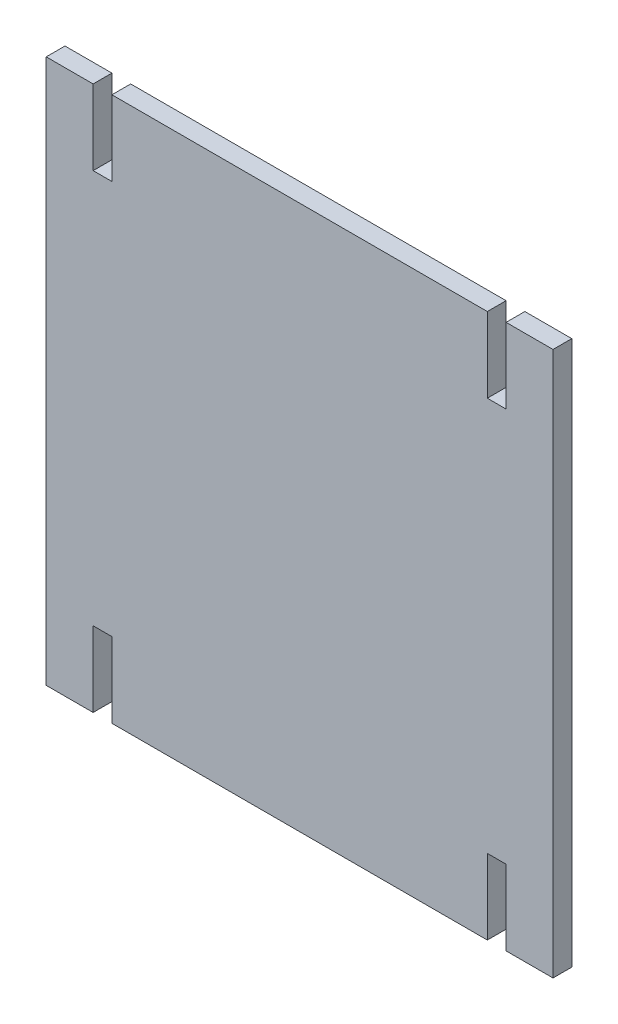
ISO-10303-21;
HEADER;
FILE_DESCRIPTION(('STEP AP214'),'2;1');
FILE_NAME('part.step','',(''),(''),'','','');
FILE_SCHEMA(('AUTOMOTIVE_DESIGN { 1 0 10303 214 1 1 1 1 }'));
ENDSEC;
DATA;
#1=APPLICATION_CONTEXT('core data for automotive mechanical design processes');
#2=APPLICATION_PROTOCOL_DEFINITION('international standard','automotive_design',2000,#1);
#3=PRODUCT_CONTEXT('',#1,'mechanical');
#4=PRODUCT('Part','Part','',(#3));
#5=PRODUCT_RELATED_PRODUCT_CATEGORY('part','',(#4));
#6=PRODUCT_DEFINITION_FORMATION('','',#4);
#7=PRODUCT_DEFINITION_CONTEXT('part definition',#1,'design');
#8=PRODUCT_DEFINITION('design','',#6,#7);
#9=PRODUCT_DEFINITION_SHAPE('','',#8);
#10=(LENGTH_UNIT() NAMED_UNIT(*) SI_UNIT(.MILLI.,.METRE.));
#11=(NAMED_UNIT(*) PLANE_ANGLE_UNIT() SI_UNIT($,.RADIAN.));
#12=(NAMED_UNIT(*) SI_UNIT($,.STERADIAN.) SOLID_ANGLE_UNIT());
#13=UNCERTAINTY_MEASURE_WITH_UNIT(LENGTH_MEASURE(1.E-05),#10,'distance_accuracy_value','');
#14=(GEOMETRIC_REPRESENTATION_CONTEXT(3) GLOBAL_UNCERTAINTY_ASSIGNED_CONTEXT((#13)) GLOBAL_UNIT_ASSIGNED_CONTEXT((#10,
#11,#12)) REPRESENTATION_CONTEXT('',''));
#15=CARTESIAN_POINT('',(0.,0.,0.));
#16=DIRECTION('',(0.,0.,1.));
#17=DIRECTION('',(1.,0.,0.));
#18=AXIS2_PLACEMENT_3D('',#15,#16,#17);
#19=CARTESIAN_POINT('',(50.8,0.,2.54));
#20=DIRECTION('',(0.,-1.,0.));
#21=DIRECTION('',(0.,0.,-1.));
#22=AXIS2_PLACEMENT_3D('',#19,#20,#21);
#23=PLANE('',#22);
#24=DIRECTION('',(-1.,0.,0.));
#25=VECTOR('',#24,1.);
#26=CARTESIAN_POINT('',(50.8,0.,0.));
#27=LINE('',#26,#25);
#28=CARTESIAN_POINT('',(50.8,0.,0.));
#29=VERTEX_POINT('',#28);
#30=CARTESIAN_POINT('',(0.,0.,0.));
#31=VERTEX_POINT('',#30);
#32=EDGE_CURVE('E200',#29,#31,#27,.T.);
#33=ORIENTED_EDGE('',*,*,#32,.T.);
#34=DIRECTION('',(0.,0.,-1.));
#35=VECTOR('',#34,1.);
#36=CARTESIAN_POINT('',(0.,0.,2.54));
#37=LINE('',#36,#35);
#38=CARTESIAN_POINT('',(0.,0.,2.54));
#39=VERTEX_POINT('',#38);
#40=EDGE_CURVE('E11',#39,#31,#37,.T.);
#41=ORIENTED_EDGE('',*,*,#40,.F.);
#42=DIRECTION('',(-1.,0.,0.));
#43=VECTOR('',#42,1.);
#44=CARTESIAN_POINT('',(50.8,0.,2.54));
#45=LINE('',#44,#43);
#46=CARTESIAN_POINT('',(50.8,0.,2.54));
#47=VERTEX_POINT('',#46);
#48=EDGE_CURVE('E238',#47,#39,#45,.T.);
#49=ORIENTED_EDGE('',*,*,#48,.F.);
#50=DIRECTION('',(0.,0.,-1.));
#51=VECTOR('',#50,1.);
#52=CARTESIAN_POINT('',(50.8,0.,2.54));
#53=LINE('',#52,#51);
#54=EDGE_CURVE('E196',#47,#29,#53,.T.);
#55=ORIENTED_EDGE('',*,*,#54,.T.);
#56=EDGE_LOOP('',(#33,#41,#49,#55));
#57=FACE_BOUND('',#56,.T.);
#58=ADVANCED_FACE('F32',(#57),#23,.F.);
#59=CARTESIAN_POINT('',(0.,0.,2.54));
#60=DIRECTION('',(1.,0.,0.));
#61=DIRECTION('',(0.,1.,0.));
#62=AXIS2_PLACEMENT_3D('',#59,#60,#61);
#63=PLANE('',#62);
#64=DIRECTION('',(0.,-1.,0.));
#65=VECTOR('',#64,1.);
#66=CARTESIAN_POINT('',(0.,0.,0.));
#67=LINE('',#66,#65);
#68=CARTESIAN_POINT('',(0.,-10.16,0.));
#69=VERTEX_POINT('',#68);
#70=EDGE_CURVE('E203',#31,#69,#67,.T.);
#71=ORIENTED_EDGE('',*,*,#70,.T.);
#72=DIRECTION('',(0.,0.,-1.));
#73=VECTOR('',#72,1.);
#74=CARTESIAN_POINT('',(0.,-10.16,2.54));
#75=LINE('',#74,#73);
#76=CARTESIAN_POINT('',(0.,-10.16,2.54));
#77=VERTEX_POINT('',#76);
#78=EDGE_CURVE('E40',#77,#69,#75,.T.);
#79=ORIENTED_EDGE('',*,*,#78,.F.);
#80=DIRECTION('',(0.,-1.,0.));
#81=VECTOR('',#80,1.);
#82=CARTESIAN_POINT('',(0.,0.,2.54));
#83=LINE('',#82,#81);
#84=EDGE_CURVE('E127',#39,#77,#83,.T.);
#85=ORIENTED_EDGE('',*,*,#84,.F.);
#86=ORIENTED_EDGE('',*,*,#40,.T.);
#87=EDGE_LOOP('',(#71,#79,#85,#86));
#88=FACE_BOUND('',#87,.T.);
#89=ADVANCED_FACE('F356',(#88),#63,.F.);
#90=CARTESIAN_POINT('',(0.,-10.16,2.54));
#91=DIRECTION('',(0.,-1.,0.));
#92=DIRECTION('',(0.,0.,-1.));
#93=AXIS2_PLACEMENT_3D('',#90,#91,#92);
#94=PLANE('',#93);
#95=DIRECTION('',(-1.,0.,0.));
#96=VECTOR('',#95,1.);
#97=CARTESIAN_POINT('',(0.,-10.16,0.));
#98=LINE('',#97,#96);
#99=CARTESIAN_POINT('',(-2.54,-10.16,0.));
#100=VERTEX_POINT('',#99);
#101=EDGE_CURVE('E205',#69,#100,#98,.T.);
#102=ORIENTED_EDGE('',*,*,#101,.T.);
#103=DIRECTION('',(0.,0.,-1.));
#104=VECTOR('',#103,1.);
#105=CARTESIAN_POINT('',(-2.54,-10.16,2.54));
#106=LINE('',#105,#104);
#107=CARTESIAN_POINT('',(-2.54,-10.16,2.54));
#108=VERTEX_POINT('',#107);
#109=EDGE_CURVE('E281',#108,#100,#106,.T.);
#110=ORIENTED_EDGE('',*,*,#109,.F.);
#111=DIRECTION('',(-1.,0.,0.));
#112=VECTOR('',#111,1.);
#113=CARTESIAN_POINT('',(0.,-10.16,2.54));
#114=LINE('',#113,#112);
#115=EDGE_CURVE('E289',#77,#108,#114,.T.);
#116=ORIENTED_EDGE('',*,*,#115,.F.);
#117=ORIENTED_EDGE('',*,*,#78,.T.);
#118=EDGE_LOOP('',(#102,#110,#116,#117));
#119=FACE_BOUND('',#118,.T.);
#120=ADVANCED_FACE('F287',(#119),#94,.F.);
#121=CARTESIAN_POINT('',(-2.54,-10.16,2.54));
#122=DIRECTION('',(-1.,0.,0.));
#123=DIRECTION('',(0.,0.,1.));
#124=AXIS2_PLACEMENT_3D('',#121,#122,#123);
#125=PLANE('',#124);
#126=DIRECTION('',(0.,1.,0.));
#127=VECTOR('',#126,1.);
#128=CARTESIAN_POINT('',(-2.54,-10.16,0.));
#129=LINE('',#128,#127);
#130=CARTESIAN_POINT('',(-2.54,0.,0.));
#131=VERTEX_POINT('',#130);
#132=EDGE_CURVE('E207',#100,#131,#129,.T.);
#133=ORIENTED_EDGE('',*,*,#132,.T.);
#134=DIRECTION('',(0.,0.,-1.));
#135=VECTOR('',#134,1.);
#136=CARTESIAN_POINT('',(-2.54,0.,2.54));
#137=LINE('',#136,#135);
#138=CARTESIAN_POINT('',(-2.54,0.,2.54));
#139=VERTEX_POINT('',#138);
#140=EDGE_CURVE('E278',#139,#131,#137,.T.);
#141=ORIENTED_EDGE('',*,*,#140,.F.);
#142=DIRECTION('',(0.,1.,0.));
#143=VECTOR('',#142,1.);
#144=CARTESIAN_POINT('',(-2.54,-10.16,2.54));
#145=LINE('',#144,#143);
#146=EDGE_CURVE('E307',#108,#139,#145,.T.);
#147=ORIENTED_EDGE('',*,*,#146,.F.);
#148=ORIENTED_EDGE('',*,*,#109,.T.);
#149=EDGE_LOOP('',(#133,#141,#147,#148));
#150=FACE_BOUND('',#149,.T.);
#151=ADVANCED_FACE('F298',(#150),#125,.F.);
#152=CARTESIAN_POINT('',(-2.54,0.,2.54));
#153=DIRECTION('',(0.,-1.,0.));
#154=DIRECTION('',(0.,0.,-1.));
#155=AXIS2_PLACEMENT_3D('',#152,#153,#154);
#156=PLANE('',#155);
#157=DIRECTION('',(-1.,0.,0.));
#158=VECTOR('',#157,1.);
#159=CARTESIAN_POINT('',(-2.54,0.,0.));
#160=LINE('',#159,#158);
#161=CARTESIAN_POINT('',(-8.89,0.,0.));
#162=VERTEX_POINT('',#161);
#163=EDGE_CURVE('E209',#131,#162,#160,.T.);
#164=ORIENTED_EDGE('',*,*,#163,.T.);
#165=DIRECTION('',(0.,0.,-1.));
#166=VECTOR('',#165,1.);
#167=CARTESIAN_POINT('',(-8.89,0.,2.54));
#168=LINE('',#167,#166);
#169=CARTESIAN_POINT('',(-8.89,0.,2.54));
#170=VERTEX_POINT('',#169);
#171=EDGE_CURVE('E275',#170,#162,#168,.T.);
#172=ORIENTED_EDGE('',*,*,#171,.F.);
#173=DIRECTION('',(-1.,0.,0.));
#174=VECTOR('',#173,1.);
#175=CARTESIAN_POINT('',(-2.54,0.,2.54));
#176=LINE('',#175,#174);
#177=EDGE_CURVE('E304',#139,#170,#176,.T.);
#178=ORIENTED_EDGE('',*,*,#177,.F.);
#179=ORIENTED_EDGE('',*,*,#140,.T.);
#180=EDGE_LOOP('',(#164,#172,#178,#179));
#181=FACE_BOUND('',#180,.T.);
#182=ADVANCED_FACE('F302',(#181),#156,.F.);
#183=CARTESIAN_POINT('',(-8.89,0.,2.54));
#184=DIRECTION('',(1.,0.,0.));
#185=DIRECTION('',(0.,0.,-1.));
#186=AXIS2_PLACEMENT_3D('',#183,#184,#185);
#187=PLANE('',#186);
#188=DIRECTION('',(0.,-1.,0.));
#189=VECTOR('',#188,1.);
#190=CARTESIAN_POINT('',(-8.89,0.,0.));
#191=LINE('',#190,#189);
#192=CARTESIAN_POINT('',(-8.89,-73.66,0.));
#193=VERTEX_POINT('',#192);
#194=EDGE_CURVE('E211',#162,#193,#191,.T.);
#195=ORIENTED_EDGE('',*,*,#194,.T.);
#196=DIRECTION('',(0.,0.,-1.));
#197=VECTOR('',#196,1.);
#198=CARTESIAN_POINT('',(-8.89,-73.66,2.54));
#199=LINE('',#198,#197);
#200=CARTESIAN_POINT('',(-8.89,-73.66,2.54));
#201=VERTEX_POINT('',#200);
#202=EDGE_CURVE('E272',#201,#193,#199,.T.);
#203=ORIENTED_EDGE('',*,*,#202,.F.);
#204=DIRECTION('',(0.,-1.,0.));
#205=VECTOR('',#204,1.);
#206=CARTESIAN_POINT('',(-8.89,0.,2.54));
#207=LINE('',#206,#205);
#208=EDGE_CURVE('E306',#170,#201,#207,.T.);
#209=ORIENTED_EDGE('',*,*,#208,.F.);
#210=ORIENTED_EDGE('',*,*,#171,.T.);
#211=EDGE_LOOP('',(#195,#203,#209,#210));
#212=FACE_BOUND('',#211,.T.);
#213=ADVANCED_FACE('F369',(#212),#187,.F.);
#214=CARTESIAN_POINT('',(-8.89,-73.66,2.54));
#215=DIRECTION('',(0.,1.,0.));
#216=DIRECTION('',(0.,0.,1.));
#217=AXIS2_PLACEMENT_3D('',#214,#215,#216);
#218=PLANE('',#217);
#219=DIRECTION('',(1.,0.,0.));
#220=VECTOR('',#219,1.);
#221=CARTESIAN_POINT('',(-8.89,-73.66,0.));
#222=LINE('',#221,#220);
#223=CARTESIAN_POINT('',(-2.54,-73.66,0.));
#224=VERTEX_POINT('',#223);
#225=EDGE_CURVE('E213',#193,#224,#222,.T.);
#226=ORIENTED_EDGE('',*,*,#225,.T.);
#227=DIRECTION('',(0.,0.,-1.));
#228=VECTOR('',#227,1.);
#229=CARTESIAN_POINT('',(-2.54,-73.66,2.54));
#230=LINE('',#229,#228);
#231=CARTESIAN_POINT('',(-2.54,-73.66,2.54));
#232=VERTEX_POINT('',#231);
#233=EDGE_CURVE('E269',#232,#224,#230,.T.);
#234=ORIENTED_EDGE('',*,*,#233,.F.);
#235=DIRECTION('',(1.,0.,0.));
#236=VECTOR('',#235,1.);
#237=CARTESIAN_POINT('',(-8.89,-73.66,2.54));
#238=LINE('',#237,#236);
#239=EDGE_CURVE('E309',#201,#232,#238,.T.);
#240=ORIENTED_EDGE('',*,*,#239,.F.);
#241=ORIENTED_EDGE('',*,*,#202,.T.);
#242=EDGE_LOOP('',(#226,#234,#240,#241));
#243=FACE_BOUND('',#242,.T.);
#244=ADVANCED_FACE('F372',(#243),#218,.F.);
#245=CARTESIAN_POINT('',(-2.54,-73.66,2.54));
#246=DIRECTION('',(-1.,0.,0.));
#247=DIRECTION('',(0.,0.,1.));
#248=AXIS2_PLACEMENT_3D('',#245,#246,#247);
#249=PLANE('',#248);
#250=DIRECTION('',(0.,1.,0.));
#251=VECTOR('',#250,1.);
#252=CARTESIAN_POINT('',(-2.54,-73.66,0.));
#253=LINE('',#252,#251);
#254=CARTESIAN_POINT('',(-2.54,-63.5,0.));
#255=VERTEX_POINT('',#254);
#256=EDGE_CURVE('E215',#224,#255,#253,.T.);
#257=ORIENTED_EDGE('',*,*,#256,.T.);
#258=DIRECTION('',(0.,0.,-1.));
#259=VECTOR('',#258,1.);
#260=CARTESIAN_POINT('',(-2.54,-63.5,2.54));
#261=LINE('',#260,#259);
#262=CARTESIAN_POINT('',(-2.54,-63.5,2.54));
#263=VERTEX_POINT('',#262);
#264=EDGE_CURVE('E266',#263,#255,#261,.T.);
#265=ORIENTED_EDGE('',*,*,#264,.F.);
#266=DIRECTION('',(0.,1.,0.));
#267=VECTOR('',#266,1.);
#268=CARTESIAN_POINT('',(-2.54,-73.66,2.54));
#269=LINE('',#268,#267);
#270=EDGE_CURVE('E315',#232,#263,#269,.T.);
#271=ORIENTED_EDGE('',*,*,#270,.F.);
#272=ORIENTED_EDGE('',*,*,#233,.T.);
#273=EDGE_LOOP('',(#257,#265,#271,#272));
#274=FACE_BOUND('',#273,.T.);
#275=ADVANCED_FACE('F376',(#274),#249,.F.);
#276=CARTESIAN_POINT('',(0.,-63.5,2.54));
#277=DIRECTION('',(0.,1.,0.));
#278=DIRECTION('',(0.,0.,1.));
#279=AXIS2_PLACEMENT_3D('',#276,#277,#278);
#280=PLANE('',#279);
#281=DIRECTION('',(1.,0.,0.));
#282=VECTOR('',#281,1.);
#283=CARTESIAN_POINT('',(0.,-63.5,0.));
#284=LINE('',#283,#282);
#285=CARTESIAN_POINT('',(0.,-63.5,0.));
#286=VERTEX_POINT('',#285);
#287=EDGE_CURVE('E217',#255,#286,#284,.T.);
#288=ORIENTED_EDGE('',*,*,#287,.T.);
#289=DIRECTION('',(0.,0.,-1.));
#290=VECTOR('',#289,1.);
#291=CARTESIAN_POINT('',(0.,-63.5,2.54));
#292=LINE('',#291,#290);
#293=CARTESIAN_POINT('',(0.,-63.5,2.54));
#294=VERTEX_POINT('',#293);
#295=EDGE_CURVE('E263',#294,#286,#292,.T.);
#296=ORIENTED_EDGE('',*,*,#295,.F.);
#297=DIRECTION('',(1.,0.,0.));
#298=VECTOR('',#297,1.);
#299=CARTESIAN_POINT('',(0.,-63.5,2.54));
#300=LINE('',#299,#298);
#301=EDGE_CURVE('E317',#263,#294,#300,.T.);
#302=ORIENTED_EDGE('',*,*,#301,.F.);
#303=ORIENTED_EDGE('',*,*,#264,.T.);
#304=EDGE_LOOP('',(#288,#296,#302,#303));
#305=FACE_BOUND('',#304,.T.);
#306=ADVANCED_FACE('F380',(#305),#280,.F.);
#307=CARTESIAN_POINT('',(0.,-73.66,2.54));
#308=DIRECTION('',(1.,0.,0.));
#309=DIRECTION('',(0.,0.,-1.));
#310=AXIS2_PLACEMENT_3D('',#307,#308,#309);
#311=PLANE('',#310);
#312=DIRECTION('',(0.,-1.,0.));
#313=VECTOR('',#312,1.);
#314=CARTESIAN_POINT('',(0.,-73.66,0.));
#315=LINE('',#314,#313);
#316=CARTESIAN_POINT('',(0.,-73.66,0.));
#317=VERTEX_POINT('',#316);
#318=EDGE_CURVE('E219',#286,#317,#315,.T.);
#319=ORIENTED_EDGE('',*,*,#318,.T.);
#320=DIRECTION('',(0.,0.,-1.));
#321=VECTOR('',#320,1.);
#322=CARTESIAN_POINT('',(0.,-73.66,2.54));
#323=LINE('',#322,#321);
#324=CARTESIAN_POINT('',(0.,-73.66,2.54));
#325=VERTEX_POINT('',#324);
#326=EDGE_CURVE('E260',#325,#317,#323,.T.);
#327=ORIENTED_EDGE('',*,*,#326,.F.);
#328=DIRECTION('',(0.,-1.,0.));
#329=VECTOR('',#328,1.);
#330=CARTESIAN_POINT('',(0.,-73.66,2.54));
#331=LINE('',#330,#329);
#332=EDGE_CURVE('E319',#294,#325,#331,.T.);
#333=ORIENTED_EDGE('',*,*,#332,.F.);
#334=ORIENTED_EDGE('',*,*,#295,.T.);
#335=EDGE_LOOP('',(#319,#327,#333,#334));
#336=FACE_BOUND('',#335,.T.);
#337=ADVANCED_FACE('F384',(#336),#311,.F.);
#338=CARTESIAN_POINT('',(0.,-73.66,2.54));
#339=DIRECTION('',(0.,1.,0.));
#340=DIRECTION('',(0.,0.,1.));
#341=AXIS2_PLACEMENT_3D('',#338,#339,#340);
#342=PLANE('',#341);
#343=DIRECTION('',(1.,0.,0.));
#344=VECTOR('',#343,1.);
#345=CARTESIAN_POINT('',(0.,-73.66,0.));
#346=LINE('',#345,#344);
#347=CARTESIAN_POINT('',(50.8,-73.66,0.));
#348=VERTEX_POINT('',#347);
#349=EDGE_CURVE('E221',#317,#348,#346,.T.);
#350=ORIENTED_EDGE('',*,*,#349,.T.);
#351=DIRECTION('',(0.,0.,-1.));
#352=VECTOR('',#351,1.);
#353=CARTESIAN_POINT('',(50.8,-73.66,2.54));
#354=LINE('',#353,#352);
#355=CARTESIAN_POINT('',(50.8,-73.66,2.54));
#356=VERTEX_POINT('',#355);
#357=EDGE_CURVE('E257',#356,#348,#354,.T.);
#358=ORIENTED_EDGE('',*,*,#357,.F.);
#359=DIRECTION('',(1.,0.,0.));
#360=VECTOR('',#359,1.);
#361=CARTESIAN_POINT('',(0.,-73.66,2.54));
#362=LINE('',#361,#360);
#363=EDGE_CURVE('E321',#325,#356,#362,.T.);
#364=ORIENTED_EDGE('',*,*,#363,.F.);
#365=ORIENTED_EDGE('',*,*,#326,.T.);
#366=EDGE_LOOP('',(#350,#358,#364,#365));
#367=FACE_BOUND('',#366,.T.);
#368=ADVANCED_FACE('F388',(#367),#342,.F.);
#369=CARTESIAN_POINT('',(50.8,-73.66,2.54));
#370=DIRECTION('',(-1.,0.,0.));
#371=DIRECTION('',(0.,0.,1.));
#372=AXIS2_PLACEMENT_3D('',#369,#370,#371);
#373=PLANE('',#372);
#374=DIRECTION('',(0.,1.,0.));
#375=VECTOR('',#374,1.);
#376=CARTESIAN_POINT('',(50.8,-73.66,0.));
#377=LINE('',#376,#375);
#378=CARTESIAN_POINT('',(50.8,-63.5,0.));
#379=VERTEX_POINT('',#378);
#380=EDGE_CURVE('E223',#348,#379,#377,.T.);
#381=ORIENTED_EDGE('',*,*,#380,.T.);
#382=DIRECTION('',(0.,0.,-1.));
#383=VECTOR('',#382,1.);
#384=CARTESIAN_POINT('',(50.8,-63.5,2.54));
#385=LINE('',#384,#383);
#386=CARTESIAN_POINT('',(50.8,-63.5,2.54));
#387=VERTEX_POINT('',#386);
#388=EDGE_CURVE('E254',#387,#379,#385,.T.);
#389=ORIENTED_EDGE('',*,*,#388,.F.);
#390=DIRECTION('',(0.,1.,0.));
#391=VECTOR('',#390,1.);
#392=CARTESIAN_POINT('',(50.8,-73.66,2.54));
#393=LINE('',#392,#391);
#394=EDGE_CURVE('E323',#356,#387,#393,.T.);
#395=ORIENTED_EDGE('',*,*,#394,.F.);
#396=ORIENTED_EDGE('',*,*,#357,.T.);
#397=EDGE_LOOP('',(#381,#389,#395,#396));
#398=FACE_BOUND('',#397,.T.);
#399=ADVANCED_FACE('F392',(#398),#373,.F.);
#400=CARTESIAN_POINT('',(50.8,-63.5,2.54));
#401=DIRECTION('',(0.,1.,0.));
#402=DIRECTION('',(0.,0.,1.));
#403=AXIS2_PLACEMENT_3D('',#400,#401,#402);
#404=PLANE('',#403);
#405=DIRECTION('',(1.,0.,0.));
#406=VECTOR('',#405,1.);
#407=CARTESIAN_POINT('',(50.8,-63.5,0.));
#408=LINE('',#407,#406);
#409=CARTESIAN_POINT('',(53.34,-63.5,0.));
#410=VERTEX_POINT('',#409);
#411=EDGE_CURVE('E225',#379,#410,#408,.T.);
#412=ORIENTED_EDGE('',*,*,#411,.T.);
#413=DIRECTION('',(0.,0.,-1.));
#414=VECTOR('',#413,1.);
#415=CARTESIAN_POINT('',(53.34,-63.5,2.54));
#416=LINE('',#415,#414);
#417=CARTESIAN_POINT('',(53.34,-63.5,2.54));
#418=VERTEX_POINT('',#417);
#419=EDGE_CURVE('E251',#418,#410,#416,.T.);
#420=ORIENTED_EDGE('',*,*,#419,.F.);
#421=DIRECTION('',(1.,0.,0.));
#422=VECTOR('',#421,1.);
#423=CARTESIAN_POINT('',(50.8,-63.5,2.54));
#424=LINE('',#423,#422);
#425=EDGE_CURVE('E325',#387,#418,#424,.T.);
#426=ORIENTED_EDGE('',*,*,#425,.F.);
#427=ORIENTED_EDGE('',*,*,#388,.T.);
#428=EDGE_LOOP('',(#412,#420,#426,#427));
#429=FACE_BOUND('',#428,.T.);
#430=ADVANCED_FACE('F396',(#429),#404,.F.);
#431=CARTESIAN_POINT('',(53.34,-63.5,2.54));
#432=DIRECTION('',(1.,0.,0.));
#433=DIRECTION('',(0.,0.,-1.));
#434=AXIS2_PLACEMENT_3D('',#431,#432,#433);
#435=PLANE('',#434);
#436=DIRECTION('',(0.,-1.,0.));
#437=VECTOR('',#436,1.);
#438=CARTESIAN_POINT('',(53.34,-63.5,0.));
#439=LINE('',#438,#437);
#440=CARTESIAN_POINT('',(53.34,-73.66,0.));
#441=VERTEX_POINT('',#440);
#442=EDGE_CURVE('E227',#410,#441,#439,.T.);
#443=ORIENTED_EDGE('',*,*,#442,.T.);
#444=DIRECTION('',(0.,0.,-1.));
#445=VECTOR('',#444,1.);
#446=CARTESIAN_POINT('',(53.34,-73.66,2.54));
#447=LINE('',#446,#445);
#448=CARTESIAN_POINT('',(53.34,-73.66,2.54));
#449=VERTEX_POINT('',#448);
#450=EDGE_CURVE('E248',#449,#441,#447,.T.);
#451=ORIENTED_EDGE('',*,*,#450,.F.);
#452=DIRECTION('',(0.,-1.,0.));
#453=VECTOR('',#452,1.);
#454=CARTESIAN_POINT('',(53.34,-63.5,2.54));
#455=LINE('',#454,#453);
#456=EDGE_CURVE('E327',#418,#449,#455,.T.);
#457=ORIENTED_EDGE('',*,*,#456,.F.);
#458=ORIENTED_EDGE('',*,*,#419,.T.);
#459=EDGE_LOOP('',(#443,#451,#457,#458));
#460=FACE_BOUND('',#459,.T.);
#461=ADVANCED_FACE('F400',(#460),#435,.F.);
#462=CARTESIAN_POINT('',(53.34,-73.66,2.54));
#463=DIRECTION('',(0.,1.,0.));
#464=DIRECTION('',(0.,0.,1.));
#465=AXIS2_PLACEMENT_3D('',#462,#463,#464);
#466=PLANE('',#465);
#467=DIRECTION('',(1.,0.,0.));
#468=VECTOR('',#467,1.);
#469=CARTESIAN_POINT('',(53.34,-73.66,0.));
#470=LINE('',#469,#468);
#471=CARTESIAN_POINT('',(59.69,-73.66,0.));
#472=VERTEX_POINT('',#471);
#473=EDGE_CURVE('E229',#441,#472,#470,.T.);
#474=ORIENTED_EDGE('',*,*,#473,.T.);
#475=DIRECTION('',(0.,0.,-1.));
#476=VECTOR('',#475,1.);
#477=CARTESIAN_POINT('',(59.69,-73.66,2.54));
#478=LINE('',#477,#476);
#479=CARTESIAN_POINT('',(59.69,-73.66,2.54));
#480=VERTEX_POINT('',#479);
#481=EDGE_CURVE('E245',#480,#472,#478,.T.);
#482=ORIENTED_EDGE('',*,*,#481,.F.);
#483=DIRECTION('',(1.,0.,0.));
#484=VECTOR('',#483,1.);
#485=CARTESIAN_POINT('',(53.34,-73.66,2.54));
#486=LINE('',#485,#484);
#487=EDGE_CURVE('E329',#449,#480,#486,.T.);
#488=ORIENTED_EDGE('',*,*,#487,.F.);
#489=ORIENTED_EDGE('',*,*,#450,.T.);
#490=EDGE_LOOP('',(#474,#482,#488,#489));
#491=FACE_BOUND('',#490,.T.);
#492=ADVANCED_FACE('F404',(#491),#466,.F.);
#493=CARTESIAN_POINT('',(59.69,-73.66,2.54));
#494=DIRECTION('',(-1.,0.,0.));
#495=DIRECTION('',(0.,0.,1.));
#496=AXIS2_PLACEMENT_3D('',#493,#494,#495);
#497=PLANE('',#496);
#498=DIRECTION('',(0.,1.,0.));
#499=VECTOR('',#498,1.);
#500=CARTESIAN_POINT('',(59.69,-73.66,0.));
#501=LINE('',#500,#499);
#502=CARTESIAN_POINT('',(59.69,0.,0.));
#503=VERTEX_POINT('',#502);
#504=EDGE_CURVE('E231',#472,#503,#501,.T.);
#505=ORIENTED_EDGE('',*,*,#504,.T.);
#506=DIRECTION('',(0.,0.,-1.));
#507=VECTOR('',#506,1.);
#508=CARTESIAN_POINT('',(59.69,0.,2.54));
#509=LINE('',#508,#507);
#510=CARTESIAN_POINT('',(59.69,0.,2.54));
#511=VERTEX_POINT('',#510);
#512=EDGE_CURVE('E242',#511,#503,#509,.T.);
#513=ORIENTED_EDGE('',*,*,#512,.F.);
#514=DIRECTION('',(0.,1.,0.));
#515=VECTOR('',#514,1.);
#516=CARTESIAN_POINT('',(59.69,-73.66,2.54));
#517=LINE('',#516,#515);
#518=EDGE_CURVE('E331',#480,#511,#517,.T.);
#519=ORIENTED_EDGE('',*,*,#518,.F.);
#520=ORIENTED_EDGE('',*,*,#481,.T.);
#521=EDGE_LOOP('',(#505,#513,#519,#520));
#522=FACE_BOUND('',#521,.T.);
#523=ADVANCED_FACE('F337',(#522),#497,.F.);
#524=CARTESIAN_POINT('',(59.69,0.,2.54));
#525=DIRECTION('',(0.,-1.,0.));
#526=DIRECTION('',(0.,0.,-1.));
#527=AXIS2_PLACEMENT_3D('',#524,#525,#526);
#528=PLANE('',#527);
#529=DIRECTION('',(-1.,0.,0.));
#530=VECTOR('',#529,1.);
#531=CARTESIAN_POINT('',(59.69,0.,0.));
#532=LINE('',#531,#530);
#533=CARTESIAN_POINT('',(53.34,0.,0.));
#534=VERTEX_POINT('',#533);
#535=EDGE_CURVE('E233',#503,#534,#532,.T.);
#536=ORIENTED_EDGE('',*,*,#535,.T.);
#537=DIRECTION('',(0.,0.,-1.));
#538=VECTOR('',#537,1.);
#539=CARTESIAN_POINT('',(53.34,0.,2.54));
#540=LINE('',#539,#538);
#541=CARTESIAN_POINT('',(53.34,0.,2.54));
#542=VERTEX_POINT('',#541);
#543=EDGE_CURVE('E191',#542,#534,#540,.T.);
#544=ORIENTED_EDGE('',*,*,#543,.F.);
#545=DIRECTION('',(-1.,0.,0.));
#546=VECTOR('',#545,1.);
#547=CARTESIAN_POINT('',(59.69,0.,2.54));
#548=LINE('',#547,#546);
#549=EDGE_CURVE('E182',#511,#542,#548,.T.);
#550=ORIENTED_EDGE('',*,*,#549,.F.);
#551=ORIENTED_EDGE('',*,*,#512,.T.);
#552=EDGE_LOOP('',(#536,#544,#550,#551));
#553=FACE_BOUND('',#552,.T.);
#554=ADVANCED_FACE('F341',(#553),#528,.F.);
#555=CARTESIAN_POINT('',(53.34,0.,2.54));
#556=DIRECTION('',(1.,0.,0.));
#557=DIRECTION('',(0.,0.,-1.));
#558=AXIS2_PLACEMENT_3D('',#555,#556,#557);
#559=PLANE('',#558);
#560=DIRECTION('',(0.,-1.,0.));
#561=VECTOR('',#560,1.);
#562=CARTESIAN_POINT('',(53.34,0.,0.));
#563=LINE('',#562,#561);
#564=CARTESIAN_POINT('',(53.34,-10.16,0.));
#565=VERTEX_POINT('',#564);
#566=EDGE_CURVE('E190',#534,#565,#563,.T.);
#567=ORIENTED_EDGE('',*,*,#566,.T.);
#568=DIRECTION('',(0.,0.,-1.));
#569=VECTOR('',#568,1.);
#570=CARTESIAN_POINT('',(53.34,-10.16,2.54));
#571=LINE('',#570,#569);
#572=CARTESIAN_POINT('',(53.34,-10.16,2.54));
#573=VERTEX_POINT('',#572);
#574=EDGE_CURVE('E187',#573,#565,#571,.T.);
#575=ORIENTED_EDGE('',*,*,#574,.F.);
#576=DIRECTION('',(0.,-1.,0.));
#577=VECTOR('',#576,1.);
#578=CARTESIAN_POINT('',(53.34,0.,2.54));
#579=LINE('',#578,#577);
#580=EDGE_CURVE('E176',#542,#573,#579,.T.);
#581=ORIENTED_EDGE('',*,*,#580,.F.);
#582=ORIENTED_EDGE('',*,*,#543,.T.);
#583=EDGE_LOOP('',(#567,#575,#581,#582));
#584=FACE_BOUND('',#583,.T.);
#585=ADVANCED_FACE('F188',(#584),#559,.F.);
#586=CARTESIAN_POINT('',(53.34,-10.16,2.54));
#587=DIRECTION('',(0.,-1.,0.));
#588=DIRECTION('',(0.,0.,-1.));
#589=AXIS2_PLACEMENT_3D('',#586,#587,#588);
#590=PLANE('',#589);
#591=DIRECTION('',(-1.,0.,0.));
#592=VECTOR('',#591,1.);
#593=CARTESIAN_POINT('',(53.34,-10.16,0.));
#594=LINE('',#593,#592);
#595=CARTESIAN_POINT('',(50.8,-10.16,0.));
#596=VERTEX_POINT('',#595);
#597=EDGE_CURVE('E113',#565,#596,#594,.T.);
#598=ORIENTED_EDGE('',*,*,#597,.T.);
#599=DIRECTION('',(0.,0.,-1.));
#600=VECTOR('',#599,1.);
#601=CARTESIAN_POINT('',(50.8,-10.16,2.54));
#602=LINE('',#601,#600);
#603=CARTESIAN_POINT('',(50.8,-10.16,2.54));
#604=VERTEX_POINT('',#603);
#605=EDGE_CURVE('E192',#604,#596,#602,.T.);
#606=ORIENTED_EDGE('',*,*,#605,.F.);
#607=DIRECTION('',(-1.,0.,0.));
#608=VECTOR('',#607,1.);
#609=CARTESIAN_POINT('',(53.34,-10.16,2.54));
#610=LINE('',#609,#608);
#611=EDGE_CURVE('E180',#573,#604,#610,.T.);
#612=ORIENTED_EDGE('',*,*,#611,.F.);
#613=ORIENTED_EDGE('',*,*,#574,.T.);
#614=EDGE_LOOP('',(#598,#606,#612,#613));
#615=FACE_BOUND('',#614,.T.);
#616=ADVANCED_FACE('F194',(#615),#590,.F.);
#617=CARTESIAN_POINT('',(50.8,-10.16,2.54));
#618=DIRECTION('',(-1.,0.,0.));
#619=DIRECTION('',(0.,0.,1.));
#620=AXIS2_PLACEMENT_3D('',#617,#618,#619);
#621=PLANE('',#620);
#622=DIRECTION('',(0.,1.,0.));
#623=VECTOR('',#622,1.);
#624=CARTESIAN_POINT('',(50.8,-10.16,0.));
#625=LINE('',#624,#623);
#626=EDGE_CURVE('E119',#596,#29,#625,.T.);
#627=ORIENTED_EDGE('',*,*,#626,.T.);
#628=ORIENTED_EDGE('',*,*,#54,.F.);
#629=DIRECTION('',(0.,1.,0.));
#630=VECTOR('',#629,1.);
#631=CARTESIAN_POINT('',(50.8,-10.16,2.54));
#632=LINE('',#631,#630);
#633=EDGE_CURVE('E48',#604,#47,#632,.T.);
#634=ORIENTED_EDGE('',*,*,#633,.F.);
#635=ORIENTED_EDGE('',*,*,#605,.T.);
#636=EDGE_LOOP('',(#627,#628,#634,#635));
#637=FACE_BOUND('',#636,.T.);
#638=ADVANCED_FACE('F345',(#637),#621,.F.);
#639=CARTESIAN_POINT('',(0.,0.,2.54));
#640=DIRECTION('',(0.,0.,1.));
#641=DIRECTION('',(1.,0.,0.));
#642=AXIS2_PLACEMENT_3D('',#639,#640,#641);
#643=PLANE('',#642);
#644=ORIENTED_EDGE('',*,*,#48,.T.);
#645=ORIENTED_EDGE('',*,*,#84,.T.);
#646=ORIENTED_EDGE('',*,*,#115,.T.);
#647=ORIENTED_EDGE('',*,*,#146,.T.);
#648=ORIENTED_EDGE('',*,*,#177,.T.);
#649=ORIENTED_EDGE('',*,*,#208,.T.);
#650=ORIENTED_EDGE('',*,*,#239,.T.);
#651=ORIENTED_EDGE('',*,*,#270,.T.);
#652=ORIENTED_EDGE('',*,*,#301,.T.);
#653=ORIENTED_EDGE('',*,*,#332,.T.);
#654=ORIENTED_EDGE('',*,*,#363,.T.);
#655=ORIENTED_EDGE('',*,*,#394,.T.);
#656=ORIENTED_EDGE('',*,*,#425,.T.);
#657=ORIENTED_EDGE('',*,*,#456,.T.);
#658=ORIENTED_EDGE('',*,*,#487,.T.);
#659=ORIENTED_EDGE('',*,*,#518,.T.);
#660=ORIENTED_EDGE('',*,*,#549,.T.);
#661=ORIENTED_EDGE('',*,*,#580,.T.);
#662=ORIENTED_EDGE('',*,*,#611,.T.);
#663=ORIENTED_EDGE('',*,*,#633,.T.);
#664=EDGE_LOOP('',(#644,#645,#646,#647,#648,#649,#650,#651,#652,#653,#654,#655,#656,#657,#658,
#659,#660,#661,#662,#663));
#665=FACE_BOUND('',#664,.T.);
#666=ADVANCED_FACE('F178',(#665),#643,.T.);
#667=CARTESIAN_POINT('',(0.,0.,0.));
#668=DIRECTION('',(0.,0.,1.));
#669=DIRECTION('',(1.,0.,0.));
#670=AXIS2_PLACEMENT_3D('',#667,#668,#669);
#671=PLANE('',#670);
#672=ORIENTED_EDGE('',*,*,#32,.F.);
#673=ORIENTED_EDGE('',*,*,#626,.F.);
#674=ORIENTED_EDGE('',*,*,#597,.F.);
#675=ORIENTED_EDGE('',*,*,#566,.F.);
#676=ORIENTED_EDGE('',*,*,#535,.F.);
#677=ORIENTED_EDGE('',*,*,#504,.F.);
#678=ORIENTED_EDGE('',*,*,#473,.F.);
#679=ORIENTED_EDGE('',*,*,#442,.F.);
#680=ORIENTED_EDGE('',*,*,#411,.F.);
#681=ORIENTED_EDGE('',*,*,#380,.F.);
#682=ORIENTED_EDGE('',*,*,#349,.F.);
#683=ORIENTED_EDGE('',*,*,#318,.F.);
#684=ORIENTED_EDGE('',*,*,#287,.F.);
#685=ORIENTED_EDGE('',*,*,#256,.F.);
#686=ORIENTED_EDGE('',*,*,#225,.F.);
#687=ORIENTED_EDGE('',*,*,#194,.F.);
#688=ORIENTED_EDGE('',*,*,#163,.F.);
#689=ORIENTED_EDGE('',*,*,#132,.F.);
#690=ORIENTED_EDGE('',*,*,#101,.F.);
#691=ORIENTED_EDGE('',*,*,#70,.F.);
#692=EDGE_LOOP('',(#672,#673,#674,#675,#676,#677,#678,#679,#680,#681,#682,#683,#684,#685,#686,
#687,#688,#689,#690,#691));
#693=FACE_BOUND('',#692,.T.);
#694=ADVANCED_FACE('F293',(#693),#671,.F.);
#695=CLOSED_SHELL('',(#58,#89,#120,#151,#182,#213,#244,#275,#306,#337,#368,#399,#430,#461,#492,
#523,#554,#585,#616,#638,#666,#694));
#696=MANIFOLD_SOLID_BREP('B2',#695);
#697=ADVANCED_BREP_SHAPE_REPRESENTATION('',(#18,#696),#14);
#698=SHAPE_DEFINITION_REPRESENTATION(#9,#697);
ENDSEC;
END-ISO-10303-21;
